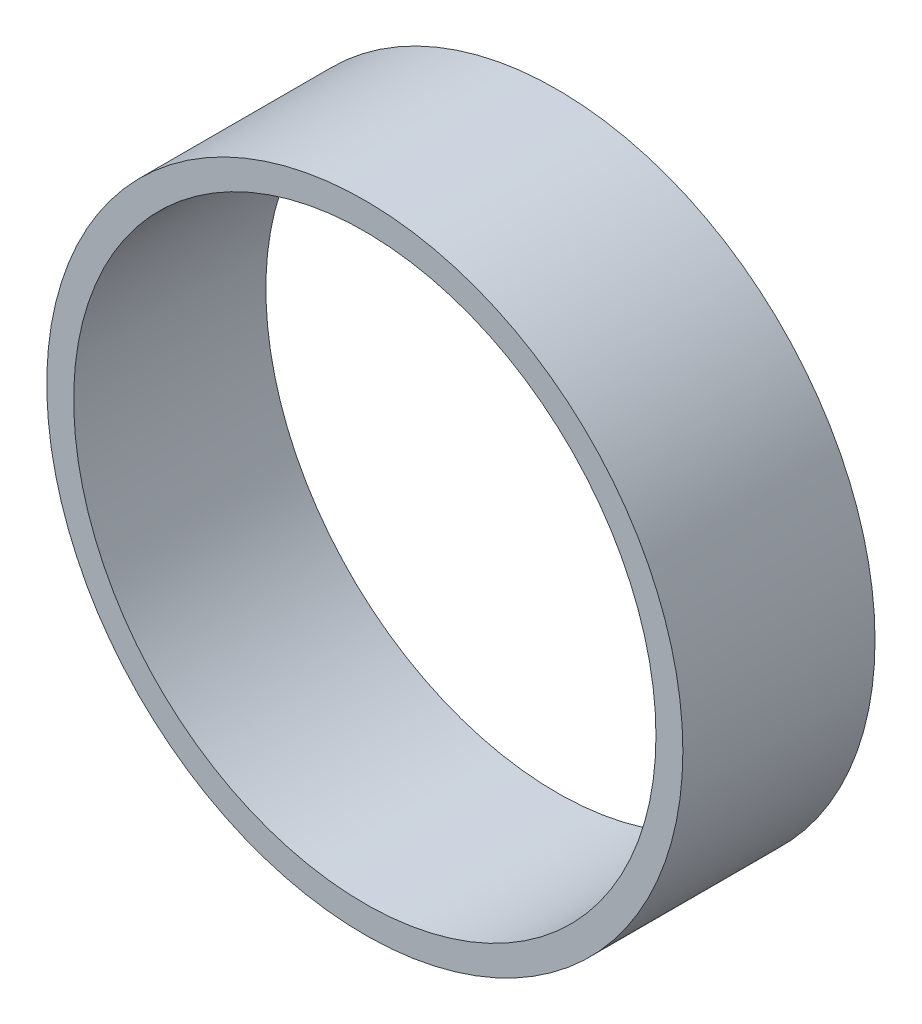
ISO-10303-21;
HEADER;
FILE_DESCRIPTION(('STEP AP214'),'2;1');
FILE_NAME('part.step','',(''),(''),'','','');
FILE_SCHEMA(('AUTOMOTIVE_DESIGN { 1 0 10303 214 1 1 1 1 }'));
ENDSEC;
DATA;
#1=APPLICATION_CONTEXT('core data for automotive mechanical design processes');
#2=APPLICATION_PROTOCOL_DEFINITION('international standard','automotive_design',2000,#1);
#3=PRODUCT_CONTEXT('',#1,'mechanical');
#4=PRODUCT('Part','Part','',(#3));
#5=PRODUCT_RELATED_PRODUCT_CATEGORY('part','',(#4));
#6=PRODUCT_DEFINITION_FORMATION('','',#4);
#7=PRODUCT_DEFINITION_CONTEXT('part definition',#1,'design');
#8=PRODUCT_DEFINITION('design','',#6,#7);
#9=PRODUCT_DEFINITION_SHAPE('','',#8);
#10=(LENGTH_UNIT() NAMED_UNIT(*) SI_UNIT(.MILLI.,.METRE.));
#11=(NAMED_UNIT(*) PLANE_ANGLE_UNIT() SI_UNIT($,.RADIAN.));
#12=(NAMED_UNIT(*) SI_UNIT($,.STERADIAN.) SOLID_ANGLE_UNIT());
#13=UNCERTAINTY_MEASURE_WITH_UNIT(LENGTH_MEASURE(1.E-05),#10,'distance_accuracy_value','');
#14=(GEOMETRIC_REPRESENTATION_CONTEXT(3) GLOBAL_UNCERTAINTY_ASSIGNED_CONTEXT((#13)) GLOBAL_UNIT_ASSIGNED_CONTEXT((#10,
#11,#12)) REPRESENTATION_CONTEXT('',''));
#15=CARTESIAN_POINT('',(0.,0.,0.));
#16=DIRECTION('',(0.,0.,1.));
#17=DIRECTION('',(1.,0.,0.));
#18=AXIS2_PLACEMENT_3D('',#15,#16,#17);
#19=CARTESIAN_POINT('',(0.,0.,50.8));
#20=DIRECTION('',(0.,0.,1.));
#21=DIRECTION('',(1.,0.,0.));
#22=AXIS2_PLACEMENT_3D('',#19,#20,#21);
#23=PLANE('',#22);
#24=CARTESIAN_POINT('',(0.,0.,50.8));
#25=DIRECTION('',(0.,0.,1.));
#26=DIRECTION('',(1.,0.,0.));
#27=AXIS2_PLACEMENT_3D('',#24,#25,#26);
#28=CIRCLE('',#27,84.074);
#29=CARTESIAN_POINT('',(84.074,0.,50.8));
#30=VERTEX_POINT('',#29);
#31=EDGE_CURVE('E10',#30,#30,#28,.T.);
#32=ORIENTED_EDGE('',*,*,#31,.T.);
#33=EDGE_LOOP('',(#32));
#34=FACE_BOUND('',#33,.T.);
#35=CARTESIAN_POINT('',(0.,0.,50.8));
#36=DIRECTION('',(0.,0.,1.));
#37=DIRECTION('',(1.,0.,0.));
#38=AXIS2_PLACEMENT_3D('',#35,#36,#37);
#39=CIRCLE('',#38,76.962);
#40=CARTESIAN_POINT('',(76.962,0.,50.8));
#41=VERTEX_POINT('',#40);
#42=EDGE_CURVE('E47',#41,#41,#39,.T.);
#43=ORIENTED_EDGE('',*,*,#42,.F.);
#44=EDGE_LOOP('',(#43));
#45=FACE_BOUND('',#44,.T.);
#46=ADVANCED_FACE('F36',(#34,#45),#23,.T.);
#47=CARTESIAN_POINT('',(0.,0.,0.));
#48=DIRECTION('',(0.,0.,1.));
#49=DIRECTION('',(1.,0.,0.));
#50=AXIS2_PLACEMENT_3D('',#47,#48,#49);
#51=PLANE('',#50);
#52=CARTESIAN_POINT('',(0.,0.,0.));
#53=DIRECTION('',(0.,0.,1.));
#54=DIRECTION('',(1.,0.,0.));
#55=AXIS2_PLACEMENT_3D('',#52,#53,#54);
#56=CIRCLE('',#55,84.074);
#57=CARTESIAN_POINT('',(84.074,0.,0.));
#58=VERTEX_POINT('',#57);
#59=EDGE_CURVE('E43',#58,#58,#56,.T.);
#60=ORIENTED_EDGE('',*,*,#59,.F.);
#61=EDGE_LOOP('',(#60));
#62=FACE_BOUND('',#61,.T.);
#63=CARTESIAN_POINT('',(0.,0.,0.));
#64=DIRECTION('',(0.,0.,1.));
#65=DIRECTION('',(1.,0.,0.));
#66=AXIS2_PLACEMENT_3D('',#63,#64,#65);
#67=CIRCLE('',#66,76.962);
#68=CARTESIAN_POINT('',(76.962,0.,0.));
#69=VERTEX_POINT('',#68);
#70=EDGE_CURVE('E51',#69,#69,#67,.T.);
#71=ORIENTED_EDGE('',*,*,#70,.T.);
#72=EDGE_LOOP('',(#71));
#73=FACE_BOUND('',#72,.T.);
#74=ADVANCED_FACE('F57',(#62,#73),#51,.F.);
#75=CARTESIAN_POINT('',(0.,0.,50.8));
#76=DIRECTION('',(0.,0.,-1.));
#77=DIRECTION('',(-1.,0.,0.));
#78=AXIS2_PLACEMENT_3D('',#75,#76,#77);
#79=CYLINDRICAL_SURFACE('',#78,84.074);
#80=ORIENTED_EDGE('',*,*,#31,.F.);
#81=EDGE_LOOP('',(#80));
#82=FACE_BOUND('',#81,.T.);
#83=ORIENTED_EDGE('',*,*,#59,.T.);
#84=EDGE_LOOP('',(#83));
#85=FACE_BOUND('',#84,.T.);
#86=ADVANCED_FACE('F38',(#82,#85),#79,.T.);
#87=CARTESIAN_POINT('',(0.,0.,50.8));
#88=DIRECTION('',(0.,0.,-1.));
#89=DIRECTION('',(-1.,0.,0.));
#90=AXIS2_PLACEMENT_3D('',#87,#88,#89);
#91=CYLINDRICAL_SURFACE('',#90,76.962);
#92=ORIENTED_EDGE('',*,*,#42,.T.);
#93=EDGE_LOOP('',(#92));
#94=FACE_BOUND('',#93,.T.);
#95=ORIENTED_EDGE('',*,*,#70,.F.);
#96=EDGE_LOOP('',(#95));
#97=FACE_BOUND('',#96,.T.);
#98=ADVANCED_FACE('F59',(#94,#97),#91,.F.);
#99=CLOSED_SHELL('',(#46,#74,#86,#98));
#100=MANIFOLD_SOLID_BREP('B2',#99);
#101=ADVANCED_BREP_SHAPE_REPRESENTATION('',(#18,#100),#14);
#102=SHAPE_DEFINITION_REPRESENTATION(#9,#101);
ENDSEC;
END-ISO-10303-21;
